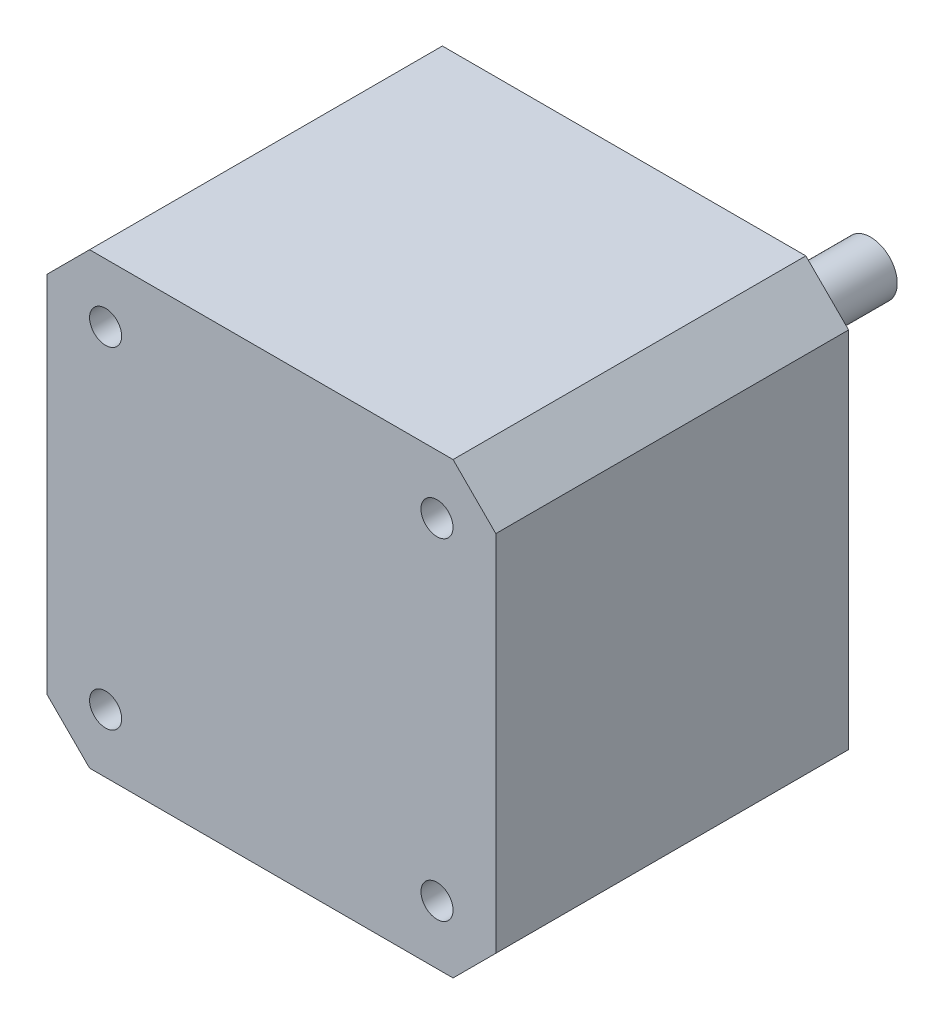
ISO-10303-21;
HEADER;
FILE_DESCRIPTION(('STEP AP214'),'2;1');
FILE_NAME('part.step','',(''),(''),'','','');
FILE_SCHEMA(('AUTOMOTIVE_DESIGN { 1 0 10303 214 1 1 1 1 }'));
ENDSEC;
DATA;
#1=APPLICATION_CONTEXT('core data for automotive mechanical design processes');
#2=APPLICATION_PROTOCOL_DEFINITION('international standard','automotive_design',2000,#1);
#3=PRODUCT_CONTEXT('',#1,'mechanical');
#4=PRODUCT('Part','Part','',(#3));
#5=PRODUCT_RELATED_PRODUCT_CATEGORY('part','',(#4));
#6=PRODUCT_DEFINITION_FORMATION('','',#4);
#7=PRODUCT_DEFINITION_CONTEXT('part definition',#1,'design');
#8=PRODUCT_DEFINITION('design','',#6,#7);
#9=PRODUCT_DEFINITION_SHAPE('','',#8);
#10=(LENGTH_UNIT() NAMED_UNIT(*) SI_UNIT(.MILLI.,.METRE.));
#11=(NAMED_UNIT(*) PLANE_ANGLE_UNIT() SI_UNIT($,.RADIAN.));
#12=(NAMED_UNIT(*) SI_UNIT($,.STERADIAN.) SOLID_ANGLE_UNIT());
#13=UNCERTAINTY_MEASURE_WITH_UNIT(LENGTH_MEASURE(1.E-05),#10,'distance_accuracy_value','');
#14=(GEOMETRIC_REPRESENTATION_CONTEXT(3) GLOBAL_UNCERTAINTY_ASSIGNED_CONTEXT((#13)) GLOBAL_UNIT_ASSIGNED_CONTEXT((#10,
#11,#12)) REPRESENTATION_CONTEXT('',''));
#15=CARTESIAN_POINT('',(0.,0.,0.));
#16=DIRECTION('',(0.,0.,1.));
#17=DIRECTION('',(1.,0.,0.));
#18=AXIS2_PLACEMENT_3D('',#15,#16,#17);
#19=CARTESIAN_POINT('',(0.,0.,-1.3));
#20=DIRECTION('',(0.,0.,-1.));
#21=DIRECTION('',(-1.,0.,0.));
#22=AXIS2_PLACEMENT_3D('',#19,#20,#21);
#23=PLANE('',#22);
#24=CARTESIAN_POINT('',(0.,0.,-1.3));
#25=DIRECTION('',(0.,0.,-1.));
#26=DIRECTION('',(-1.,0.,0.));
#27=AXIS2_PLACEMENT_3D('',#24,#25,#26);
#28=CIRCLE('',#27,11.);
#29=CARTESIAN_POINT('',(-11.,0.,-1.3));
#30=VERTEX_POINT('',#29);
#31=EDGE_CURVE('E205',#30,#30,#28,.T.);
#32=ORIENTED_EDGE('',*,*,#31,.T.);
#33=EDGE_LOOP('',(#32));
#34=FACE_BOUND('',#33,.T.);
#35=CARTESIAN_POINT('',(0.,0.,-1.3));
#36=DIRECTION('',(0.,0.,-1.));
#37=DIRECTION('',(-1.,0.,0.));
#38=AXIS2_PLACEMENT_3D('',#35,#36,#37);
#39=CIRCLE('',#38,2.5);
#40=CARTESIAN_POINT('',(-2.5,0.,-1.3));
#41=VERTEX_POINT('',#40);
#42=EDGE_CURVE('E224',#41,#41,#39,.T.);
#43=ORIENTED_EDGE('',*,*,#42,.F.);
#44=EDGE_LOOP('',(#43));
#45=FACE_BOUND('',#44,.T.);
#46=ADVANCED_FACE('F38',(#34,#45),#23,.T.);
#47=CARTESIAN_POINT('',(0.,0.,0.));
#48=DIRECTION('',(0.,0.,-1.));
#49=DIRECTION('',(-1.,0.,0.));
#50=AXIS2_PLACEMENT_3D('',#47,#48,#49);
#51=PLANE('',#50);
#52=CARTESIAN_POINT('',(-15.5,-15.5,0.));
#53=DIRECTION('',(0.,0.,-1.));
#54=DIRECTION('',(1.,0.,0.));
#55=AXIS2_PLACEMENT_3D('',#52,#53,#54);
#56=CIRCLE('',#55,1.5);
#57=CARTESIAN_POINT('',(-14.,-15.5,0.));
#58=VERTEX_POINT('',#57);
#59=EDGE_CURVE('E253',#58,#58,#56,.T.);
#60=ORIENTED_EDGE('',*,*,#59,.F.);
#61=EDGE_LOOP('',(#60));
#62=FACE_BOUND('',#61,.T.);
#63=CARTESIAN_POINT('',(15.5,-15.5,0.));
#64=DIRECTION('',(0.,0.,-1.));
#65=DIRECTION('',(-1.,0.,0.));
#66=AXIS2_PLACEMENT_3D('',#63,#64,#65);
#67=CIRCLE('',#66,1.5);
#68=CARTESIAN_POINT('',(14.,-15.5,0.));
#69=VERTEX_POINT('',#68);
#70=EDGE_CURVE('E246',#69,#69,#67,.T.);
#71=ORIENTED_EDGE('',*,*,#70,.F.);
#72=EDGE_LOOP('',(#71));
#73=FACE_BOUND('',#72,.T.);
#74=CARTESIAN_POINT('',(15.5,15.5,0.));
#75=DIRECTION('',(0.,0.,-1.));
#76=DIRECTION('',(1.,0.,0.));
#77=AXIS2_PLACEMENT_3D('',#74,#75,#76);
#78=CIRCLE('',#77,1.5);
#79=CARTESIAN_POINT('',(17.,15.5,0.));
#80=VERTEX_POINT('',#79);
#81=EDGE_CURVE('E239',#80,#80,#78,.T.);
#82=ORIENTED_EDGE('',*,*,#81,.F.);
#83=EDGE_LOOP('',(#82));
#84=FACE_BOUND('',#83,.T.);
#85=CARTESIAN_POINT('',(-15.5,15.5,0.));
#86=DIRECTION('',(0.,0.,-1.));
#87=DIRECTION('',(-1.,0.,0.));
#88=AXIS2_PLACEMENT_3D('',#85,#86,#87);
#89=CIRCLE('',#88,1.5);
#90=CARTESIAN_POINT('',(-17.,15.5,0.));
#91=VERTEX_POINT('',#90);
#92=EDGE_CURVE('E232',#91,#91,#89,.T.);
#93=ORIENTED_EDGE('',*,*,#92,.F.);
#94=EDGE_LOOP('',(#93));
#95=FACE_BOUND('',#94,.T.);
#96=DIRECTION('',(1.,0.,0.));
#97=VECTOR('',#96,1.);
#98=CARTESIAN_POINT('',(-21.,-21.,0.));
#99=LINE('',#98,#97);
#100=CARTESIAN_POINT('',(-17.,-21.,0.));
#101=VERTEX_POINT('',#100);
#102=CARTESIAN_POINT('',(17.,-21.,0.));
#103=VERTEX_POINT('',#102);
#104=EDGE_CURVE('E138',#101,#103,#99,.T.);
#105=ORIENTED_EDGE('',*,*,#104,.F.);
#106=DIRECTION('',(0.707106781186546,-0.707106781186549,0.));
#107=VECTOR('',#106,1.);
#108=CARTESIAN_POINT('',(-19.,-19.,0.));
#109=LINE('',#108,#107);
#110=CARTESIAN_POINT('',(-21.,-17.,0.));
#111=VERTEX_POINT('',#110);
#112=EDGE_CURVE('E120',#101,#111,#109,.F.);
#113=ORIENTED_EDGE('',*,*,#112,.T.);
#114=DIRECTION('',(0.,-1.,0.));
#115=VECTOR('',#114,1.);
#116=CARTESIAN_POINT('',(-21.,-21.,0.));
#117=LINE('',#116,#115);
#118=CARTESIAN_POINT('',(-21.,17.,0.));
#119=VERTEX_POINT('',#118);
#120=EDGE_CURVE('E151',#119,#111,#117,.T.);
#121=ORIENTED_EDGE('',*,*,#120,.F.);
#122=DIRECTION('',(-0.707106781186549,-0.707106781186546,0.));
#123=VECTOR('',#122,1.);
#124=CARTESIAN_POINT('',(-19.,19.,0.));
#125=LINE('',#124,#123);
#126=CARTESIAN_POINT('',(-17.,21.,0.));
#127=VERTEX_POINT('',#126);
#128=EDGE_CURVE('E166',#119,#127,#125,.F.);
#129=ORIENTED_EDGE('',*,*,#128,.T.);
#130=DIRECTION('',(-1.,0.,0.));
#131=VECTOR('',#130,1.);
#132=CARTESIAN_POINT('',(-21.,21.,0.));
#133=LINE('',#132,#131);
#134=CARTESIAN_POINT('',(17.,21.,0.));
#135=VERTEX_POINT('',#134);
#136=EDGE_CURVE('E158',#135,#127,#133,.T.);
#137=ORIENTED_EDGE('',*,*,#136,.F.);
#138=DIRECTION('',(-0.707106781186546,0.707106781186549,0.));
#139=VECTOR('',#138,1.);
#140=CARTESIAN_POINT('',(19.,19.,0.));
#141=LINE('',#140,#139);
#142=CARTESIAN_POINT('',(21.,17.,0.));
#143=VERTEX_POINT('',#142);
#144=EDGE_CURVE('E143',#135,#143,#141,.F.);
#145=ORIENTED_EDGE('',*,*,#144,.T.);
#146=DIRECTION('',(0.,1.,0.));
#147=VECTOR('',#146,1.);
#148=CARTESIAN_POINT('',(21.,-21.,0.));
#149=LINE('',#148,#147);
#150=CARTESIAN_POINT('',(21.,-17.,0.));
#151=VERTEX_POINT('',#150);
#152=EDGE_CURVE('E202',#151,#143,#149,.T.);
#153=ORIENTED_EDGE('',*,*,#152,.F.);
#154=DIRECTION('',(0.707106781186549,0.707106781186546,0.));
#155=VECTOR('',#154,1.);
#156=CARTESIAN_POINT('',(19.,-19.,0.));
#157=LINE('',#156,#155);
#158=EDGE_CURVE('E132',#151,#103,#157,.F.);
#159=ORIENTED_EDGE('',*,*,#158,.T.);
#160=EDGE_LOOP('',(#105,#113,#121,#129,#137,#145,#153,#159));
#161=FACE_BOUND('',#160,.T.);
#162=CARTESIAN_POINT('',(0.,0.,0.));
#163=DIRECTION('',(0.,0.,-1.));
#164=DIRECTION('',(-1.,0.,0.));
#165=AXIS2_PLACEMENT_3D('',#162,#163,#164);
#166=CIRCLE('',#165,11.);
#167=CARTESIAN_POINT('',(-11.,0.,0.));
#168=VERTEX_POINT('',#167);
#169=EDGE_CURVE('E216',#168,#168,#166,.T.);
#170=ORIENTED_EDGE('',*,*,#169,.F.);
#171=EDGE_LOOP('',(#170));
#172=FACE_BOUND('',#171,.T.);
#173=ADVANCED_FACE('F146',(#62,#73,#84,#95,#161,#172),#51,.T.);
#174=CARTESIAN_POINT('',(21.,-21.,33.));
#175=DIRECTION('',(-1.,0.,0.));
#176=DIRECTION('',(0.,0.,1.));
#177=AXIS2_PLACEMENT_3D('',#174,#175,#176);
#178=PLANE('',#177);
#179=DIRECTION('',(0.,1.,0.));
#180=VECTOR('',#179,1.);
#181=CARTESIAN_POINT('',(21.,-21.,33.));
#182=LINE('',#181,#180);
#183=CARTESIAN_POINT('',(21.,-17.,33.));
#184=VERTEX_POINT('',#183);
#185=CARTESIAN_POINT('',(21.,17.,33.));
#186=VERTEX_POINT('',#185);
#187=EDGE_CURVE('E150',#184,#186,#182,.T.);
#188=ORIENTED_EDGE('',*,*,#187,.F.);
#189=DIRECTION('',(0.,0.,-1.));
#190=VECTOR('',#189,1.);
#191=CARTESIAN_POINT('',(21.,-17.,33.));
#192=LINE('',#191,#190);
#193=EDGE_CURVE('E190',#184,#151,#192,.T.);
#194=ORIENTED_EDGE('',*,*,#193,.T.);
#195=ORIENTED_EDGE('',*,*,#152,.T.);
#196=DIRECTION('',(0.,0.,1.));
#197=VECTOR('',#196,1.);
#198=CARTESIAN_POINT('',(21.,17.,33.));
#199=LINE('',#198,#197);
#200=EDGE_CURVE('E187',#143,#186,#199,.T.);
#201=ORIENTED_EDGE('',*,*,#200,.T.);
#202=EDGE_LOOP('',(#188,#194,#195,#201));
#203=FACE_BOUND('',#202,.T.);
#204=ADVANCED_FACE('F273',(#203),#178,.F.);
#205=CARTESIAN_POINT('',(-21.,21.,33.));
#206=DIRECTION('',(0.,-1.,0.));
#207=DIRECTION('',(0.,0.,-1.));
#208=AXIS2_PLACEMENT_3D('',#205,#206,#207);
#209=PLANE('',#208);
#210=ORIENTED_EDGE('',*,*,#136,.T.);
#211=DIRECTION('',(0.,0.,1.));
#212=VECTOR('',#211,1.);
#213=CARTESIAN_POINT('',(-17.,21.,33.));
#214=LINE('',#213,#212);
#215=CARTESIAN_POINT('',(-17.,21.,33.));
#216=VERTEX_POINT('',#215);
#217=EDGE_CURVE('E11',#127,#216,#214,.T.);
#218=ORIENTED_EDGE('',*,*,#217,.T.);
#219=DIRECTION('',(-1.,0.,0.));
#220=VECTOR('',#219,1.);
#221=CARTESIAN_POINT('',(-21.,21.,33.));
#222=LINE('',#221,#220);
#223=CARTESIAN_POINT('',(17.,21.,33.));
#224=VERTEX_POINT('',#223);
#225=EDGE_CURVE('E156',#224,#216,#222,.T.);
#226=ORIENTED_EDGE('',*,*,#225,.F.);
#227=DIRECTION('',(0.,0.,-1.));
#228=VECTOR('',#227,1.);
#229=CARTESIAN_POINT('',(17.,21.,33.));
#230=LINE('',#229,#228);
#231=EDGE_CURVE('E47',#224,#135,#230,.T.);
#232=ORIENTED_EDGE('',*,*,#231,.T.);
#233=EDGE_LOOP('',(#210,#218,#226,#232));
#234=FACE_BOUND('',#233,.T.);
#235=ADVANCED_FACE('F198',(#234),#209,.F.);
#236=CARTESIAN_POINT('',(-21.,-21.,33.));
#237=DIRECTION('',(1.,0.,0.));
#238=DIRECTION('',(0.,0.,-1.));
#239=AXIS2_PLACEMENT_3D('',#236,#237,#238);
#240=PLANE('',#239);
#241=ORIENTED_EDGE('',*,*,#120,.T.);
#242=DIRECTION('',(0.,0.,1.));
#243=VECTOR('',#242,1.);
#244=CARTESIAN_POINT('',(-21.,-17.,33.));
#245=LINE('',#244,#243);
#246=CARTESIAN_POINT('',(-21.,-17.,33.));
#247=VERTEX_POINT('',#246);
#248=EDGE_CURVE('E125',#111,#247,#245,.T.);
#249=ORIENTED_EDGE('',*,*,#248,.T.);
#250=DIRECTION('',(0.,-1.,0.));
#251=VECTOR('',#250,1.);
#252=CARTESIAN_POINT('',(-21.,-21.,33.));
#253=LINE('',#252,#251);
#254=CARTESIAN_POINT('',(-21.,17.,33.));
#255=VERTEX_POINT('',#254);
#256=EDGE_CURVE('E210',#255,#247,#253,.T.);
#257=ORIENTED_EDGE('',*,*,#256,.F.);
#258=DIRECTION('',(0.,0.,-1.));
#259=VECTOR('',#258,1.);
#260=CARTESIAN_POINT('',(-21.,17.,33.));
#261=LINE('',#260,#259);
#262=EDGE_CURVE('E131',#255,#119,#261,.T.);
#263=ORIENTED_EDGE('',*,*,#262,.T.);
#264=EDGE_LOOP('',(#241,#249,#257,#263));
#265=FACE_BOUND('',#264,.T.);
#266=ADVANCED_FACE('F313',(#265),#240,.F.);
#267=CARTESIAN_POINT('',(-21.,-21.,33.));
#268=DIRECTION('',(0.,1.,0.));
#269=DIRECTION('',(0.,0.,1.));
#270=AXIS2_PLACEMENT_3D('',#267,#268,#269);
#271=PLANE('',#270);
#272=DIRECTION('',(1.,0.,0.));
#273=VECTOR('',#272,1.);
#274=CARTESIAN_POINT('',(-21.,-21.,33.));
#275=LINE('',#274,#273);
#276=CARTESIAN_POINT('',(-17.,-21.,33.));
#277=VERTEX_POINT('',#276);
#278=CARTESIAN_POINT('',(17.,-21.,33.));
#279=VERTEX_POINT('',#278);
#280=EDGE_CURVE('E141',#277,#279,#275,.T.);
#281=ORIENTED_EDGE('',*,*,#280,.F.);
#282=DIRECTION('',(0.,0.,-1.));
#283=VECTOR('',#282,1.);
#284=CARTESIAN_POINT('',(-17.,-21.,33.));
#285=LINE('',#284,#283);
#286=EDGE_CURVE('E124',#277,#101,#285,.T.);
#287=ORIENTED_EDGE('',*,*,#286,.T.);
#288=ORIENTED_EDGE('',*,*,#104,.T.);
#289=DIRECTION('',(0.,0.,1.));
#290=VECTOR('',#289,1.);
#291=CARTESIAN_POINT('',(17.,-21.,33.));
#292=LINE('',#291,#290);
#293=EDGE_CURVE('E144',#103,#279,#292,.T.);
#294=ORIENTED_EDGE('',*,*,#293,.T.);
#295=EDGE_LOOP('',(#281,#287,#288,#294));
#296=FACE_BOUND('',#295,.T.);
#297=ADVANCED_FACE('F137',(#296),#271,.F.);
#298=CARTESIAN_POINT('',(0.,0.,33.));
#299=DIRECTION('',(0.,0.,-1.));
#300=DIRECTION('',(-1.,0.,0.));
#301=AXIS2_PLACEMENT_3D('',#298,#299,#300);
#302=PLANE('',#301);
#303=CARTESIAN_POINT('',(-15.5,-15.5,33.));
#304=DIRECTION('',(0.,0.,-1.));
#305=DIRECTION('',(1.,0.,0.));
#306=AXIS2_PLACEMENT_3D('',#303,#304,#305);
#307=CIRCLE('',#306,1.5);
#308=CARTESIAN_POINT('',(-14.,-15.5,33.));
#309=VERTEX_POINT('',#308);
#310=EDGE_CURVE('E250',#309,#309,#307,.T.);
#311=ORIENTED_EDGE('',*,*,#310,.T.);
#312=EDGE_LOOP('',(#311));
#313=FACE_BOUND('',#312,.T.);
#314=CARTESIAN_POINT('',(15.5,-15.5,33.));
#315=DIRECTION('',(0.,0.,-1.));
#316=DIRECTION('',(-1.,0.,0.));
#317=AXIS2_PLACEMENT_3D('',#314,#315,#316);
#318=CIRCLE('',#317,1.5);
#319=CARTESIAN_POINT('',(14.,-15.5,33.));
#320=VERTEX_POINT('',#319);
#321=EDGE_CURVE('E242',#320,#320,#318,.T.);
#322=ORIENTED_EDGE('',*,*,#321,.T.);
#323=EDGE_LOOP('',(#322));
#324=FACE_BOUND('',#323,.T.);
#325=CARTESIAN_POINT('',(15.5,15.5,33.));
#326=DIRECTION('',(0.,0.,-1.));
#327=DIRECTION('',(1.,0.,0.));
#328=AXIS2_PLACEMENT_3D('',#325,#326,#327);
#329=CIRCLE('',#328,1.5);
#330=CARTESIAN_POINT('',(17.,15.5,33.));
#331=VERTEX_POINT('',#330);
#332=EDGE_CURVE('E235',#331,#331,#329,.T.);
#333=ORIENTED_EDGE('',*,*,#332,.T.);
#334=EDGE_LOOP('',(#333));
#335=FACE_BOUND('',#334,.T.);
#336=CARTESIAN_POINT('',(-15.5,15.5,33.));
#337=DIRECTION('',(0.,0.,-1.));
#338=DIRECTION('',(-1.,0.,0.));
#339=AXIS2_PLACEMENT_3D('',#336,#337,#338);
#340=CIRCLE('',#339,1.5);
#341=CARTESIAN_POINT('',(-17.,15.5,33.));
#342=VERTEX_POINT('',#341);
#343=EDGE_CURVE('E228',#342,#342,#340,.T.);
#344=ORIENTED_EDGE('',*,*,#343,.T.);
#345=EDGE_LOOP('',(#344));
#346=FACE_BOUND('',#345,.T.);
#347=ORIENTED_EDGE('',*,*,#256,.T.);
#348=DIRECTION('',(-0.707106781186546,0.707106781186549,0.));
#349=VECTOR('',#348,1.);
#350=CARTESIAN_POINT('',(-17.,-21.,33.));
#351=LINE('',#350,#349);
#352=EDGE_CURVE('E184',#247,#277,#351,.F.);
#353=ORIENTED_EDGE('',*,*,#352,.T.);
#354=ORIENTED_EDGE('',*,*,#280,.T.);
#355=DIRECTION('',(-0.707106781186549,-0.707106781186546,0.));
#356=VECTOR('',#355,1.);
#357=CARTESIAN_POINT('',(21.,-17.,33.));
#358=LINE('',#357,#356);
#359=EDGE_CURVE('E181',#279,#184,#358,.F.);
#360=ORIENTED_EDGE('',*,*,#359,.T.);
#361=ORIENTED_EDGE('',*,*,#187,.T.);
#362=DIRECTION('',(0.707106781186546,-0.707106781186549,0.));
#363=VECTOR('',#362,1.);
#364=CARTESIAN_POINT('',(17.,21.,33.));
#365=LINE('',#364,#363);
#366=EDGE_CURVE('E64',#186,#224,#365,.F.);
#367=ORIENTED_EDGE('',*,*,#366,.T.);
#368=ORIENTED_EDGE('',*,*,#225,.T.);
#369=DIRECTION('',(0.707106781186549,0.707106781186546,0.));
#370=VECTOR('',#369,1.);
#371=CARTESIAN_POINT('',(-21.,17.,33.));
#372=LINE('',#371,#370);
#373=EDGE_CURVE('E178',#216,#255,#372,.F.);
#374=ORIENTED_EDGE('',*,*,#373,.T.);
#375=EDGE_LOOP('',(#347,#353,#354,#360,#361,#367,#368,#374));
#376=FACE_BOUND('',#375,.T.);
#377=ADVANCED_FACE('F261',(#313,#324,#335,#346,#376),#302,.F.);
#378=CARTESIAN_POINT('',(-17.,-21.,33.));
#379=DIRECTION('',(0.707106781186549,0.707106781186546,0.));
#380=DIRECTION('',(0.,0.,-1.));
#381=AXIS2_PLACEMENT_3D('',#378,#379,#380);
#382=PLANE('',#381);
#383=ORIENTED_EDGE('',*,*,#352,.F.);
#384=ORIENTED_EDGE('',*,*,#248,.F.);
#385=ORIENTED_EDGE('',*,*,#112,.F.);
#386=ORIENTED_EDGE('',*,*,#286,.F.);
#387=EDGE_LOOP('',(#383,#384,#385,#386));
#388=FACE_BOUND('',#387,.T.);
#389=ADVANCED_FACE('F123',(#388),#382,.F.);
#390=CARTESIAN_POINT('',(21.,-17.,33.));
#391=DIRECTION('',(-0.707106781186546,0.707106781186549,0.));
#392=DIRECTION('',(0.,0.,-1.));
#393=AXIS2_PLACEMENT_3D('',#390,#391,#392);
#394=PLANE('',#393);
#395=ORIENTED_EDGE('',*,*,#359,.F.);
#396=ORIENTED_EDGE('',*,*,#293,.F.);
#397=ORIENTED_EDGE('',*,*,#158,.F.);
#398=ORIENTED_EDGE('',*,*,#193,.F.);
#399=EDGE_LOOP('',(#395,#396,#397,#398));
#400=FACE_BOUND('',#399,.T.);
#401=ADVANCED_FACE('F324',(#400),#394,.F.);
#402=CARTESIAN_POINT('',(-21.,17.,33.));
#403=DIRECTION('',(0.707106781186546,-0.707106781186549,0.));
#404=DIRECTION('',(0.,0.,-1.));
#405=AXIS2_PLACEMENT_3D('',#402,#403,#404);
#406=PLANE('',#405);
#407=ORIENTED_EDGE('',*,*,#373,.F.);
#408=ORIENTED_EDGE('',*,*,#217,.F.);
#409=ORIENTED_EDGE('',*,*,#128,.F.);
#410=ORIENTED_EDGE('',*,*,#262,.F.);
#411=EDGE_LOOP('',(#407,#408,#409,#410));
#412=FACE_BOUND('',#411,.T.);
#413=ADVANCED_FACE('F326',(#412),#406,.F.);
#414=CARTESIAN_POINT('',(17.,21.,33.));
#415=DIRECTION('',(-0.707106781186549,-0.707106781186546,0.));
#416=DIRECTION('',(0.,0.,-1.));
#417=AXIS2_PLACEMENT_3D('',#414,#415,#416);
#418=PLANE('',#417);
#419=ORIENTED_EDGE('',*,*,#366,.F.);
#420=ORIENTED_EDGE('',*,*,#200,.F.);
#421=ORIENTED_EDGE('',*,*,#144,.F.);
#422=ORIENTED_EDGE('',*,*,#231,.F.);
#423=EDGE_LOOP('',(#419,#420,#421,#422));
#424=FACE_BOUND('',#423,.T.);
#425=ADVANCED_FACE('F40',(#424),#418,.F.);
#426=CARTESIAN_POINT('',(0.,0.,-1.3));
#427=DIRECTION('',(0.,0.,1.));
#428=DIRECTION('',(1.,0.,0.));
#429=AXIS2_PLACEMENT_3D('',#426,#427,#428);
#430=CYLINDRICAL_SURFACE('',#429,11.);
#431=ORIENTED_EDGE('',*,*,#31,.F.);
#432=EDGE_LOOP('',(#431));
#433=FACE_BOUND('',#432,.T.);
#434=ORIENTED_EDGE('',*,*,#169,.T.);
#435=EDGE_LOOP('',(#434));
#436=FACE_BOUND('',#435,.T.);
#437=ADVANCED_FACE('F305',(#433,#436),#430,.T.);
#438=CARTESIAN_POINT('',(0.,0.,-23.05));
#439=DIRECTION('',(0.,0.,1.));
#440=DIRECTION('',(1.,0.,0.));
#441=AXIS2_PLACEMENT_3D('',#438,#439,#440);
#442=CYLINDRICAL_SURFACE('',#441,2.5);
#443=CARTESIAN_POINT('',(0.,0.,-23.05));
#444=DIRECTION('',(0.,0.,-1.));
#445=DIRECTION('',(-1.,0.,0.));
#446=AXIS2_PLACEMENT_3D('',#443,#444,#445);
#447=CIRCLE('',#446,2.5);
#448=CARTESIAN_POINT('',(-2.5,0.,-23.05));
#449=VERTEX_POINT('',#448);
#450=EDGE_CURVE('E220',#449,#449,#447,.T.);
#451=ORIENTED_EDGE('',*,*,#450,.F.);
#452=EDGE_LOOP('',(#451));
#453=FACE_BOUND('',#452,.T.);
#454=ORIENTED_EDGE('',*,*,#42,.T.);
#455=EDGE_LOOP('',(#454));
#456=FACE_BOUND('',#455,.T.);
#457=ADVANCED_FACE('F293',(#453,#456),#442,.T.);
#458=CARTESIAN_POINT('',(0.,0.,-23.05));
#459=DIRECTION('',(0.,0.,-1.));
#460=DIRECTION('',(-1.,0.,0.));
#461=AXIS2_PLACEMENT_3D('',#458,#459,#460);
#462=PLANE('',#461);
#463=ORIENTED_EDGE('',*,*,#450,.T.);
#464=EDGE_LOOP('',(#463));
#465=FACE_BOUND('',#464,.T.);
#466=ADVANCED_FACE('F284',(#465),#462,.T.);
#467=CARTESIAN_POINT('',(-15.5,15.5,33.));
#468=DIRECTION('',(0.,0.,-1.));
#469=DIRECTION('',(-1.,0.,0.));
#470=AXIS2_PLACEMENT_3D('',#467,#468,#469);
#471=CYLINDRICAL_SURFACE('',#470,1.5);
#472=ORIENTED_EDGE('',*,*,#343,.F.);
#473=EDGE_LOOP('',(#472));
#474=FACE_BOUND('',#473,.T.);
#475=ORIENTED_EDGE('',*,*,#92,.T.);
#476=EDGE_LOOP('',(#475));
#477=FACE_BOUND('',#476,.T.);
#478=ADVANCED_FACE('F281',(#474,#477),#471,.F.);
#479=CARTESIAN_POINT('',(15.5,15.5,33.));
#480=DIRECTION('',(0.,0.,-1.));
#481=DIRECTION('',(-1.,0.,0.));
#482=AXIS2_PLACEMENT_3D('',#479,#480,#481);
#483=CYLINDRICAL_SURFACE('',#482,1.5);
#484=ORIENTED_EDGE('',*,*,#332,.F.);
#485=EDGE_LOOP('',(#484));
#486=FACE_BOUND('',#485,.T.);
#487=ORIENTED_EDGE('',*,*,#81,.T.);
#488=EDGE_LOOP('',(#487));
#489=FACE_BOUND('',#488,.T.);
#490=ADVANCED_FACE('F283',(#486,#489),#483,.F.);
#491=CARTESIAN_POINT('',(15.5,-15.5,33.));
#492=DIRECTION('',(0.,0.,-1.));
#493=DIRECTION('',(-1.,0.,0.));
#494=AXIS2_PLACEMENT_3D('',#491,#492,#493);
#495=CYLINDRICAL_SURFACE('',#494,1.5);
#496=ORIENTED_EDGE('',*,*,#321,.F.);
#497=EDGE_LOOP('',(#496));
#498=FACE_BOUND('',#497,.T.);
#499=ORIENTED_EDGE('',*,*,#70,.T.);
#500=EDGE_LOOP('',(#499));
#501=FACE_BOUND('',#500,.T.);
#502=ADVANCED_FACE('F267',(#498,#501),#495,.F.);
#503=CARTESIAN_POINT('',(-15.5,-15.5,33.));
#504=DIRECTION('',(0.,0.,-1.));
#505=DIRECTION('',(-1.,0.,0.));
#506=AXIS2_PLACEMENT_3D('',#503,#504,#505);
#507=CYLINDRICAL_SURFACE('',#506,1.5);
#508=ORIENTED_EDGE('',*,*,#310,.F.);
#509=EDGE_LOOP('',(#508));
#510=FACE_BOUND('',#509,.T.);
#511=ORIENTED_EDGE('',*,*,#59,.T.);
#512=EDGE_LOOP('',(#511));
#513=FACE_BOUND('',#512,.T.);
#514=ADVANCED_FACE('F264',(#510,#513),#507,.F.);
#515=CLOSED_SHELL('',(#46,#173,#204,#235,#266,#297,#377,#389,#401,#413,#425,#437,#457,#466,#478,
#490,#502,#514));
#516=MANIFOLD_SOLID_BREP('B2',#515);
#517=ADVANCED_BREP_SHAPE_REPRESENTATION('',(#18,#516),#14);
#518=SHAPE_DEFINITION_REPRESENTATION(#9,#517);
ENDSEC;
END-ISO-10303-21;
